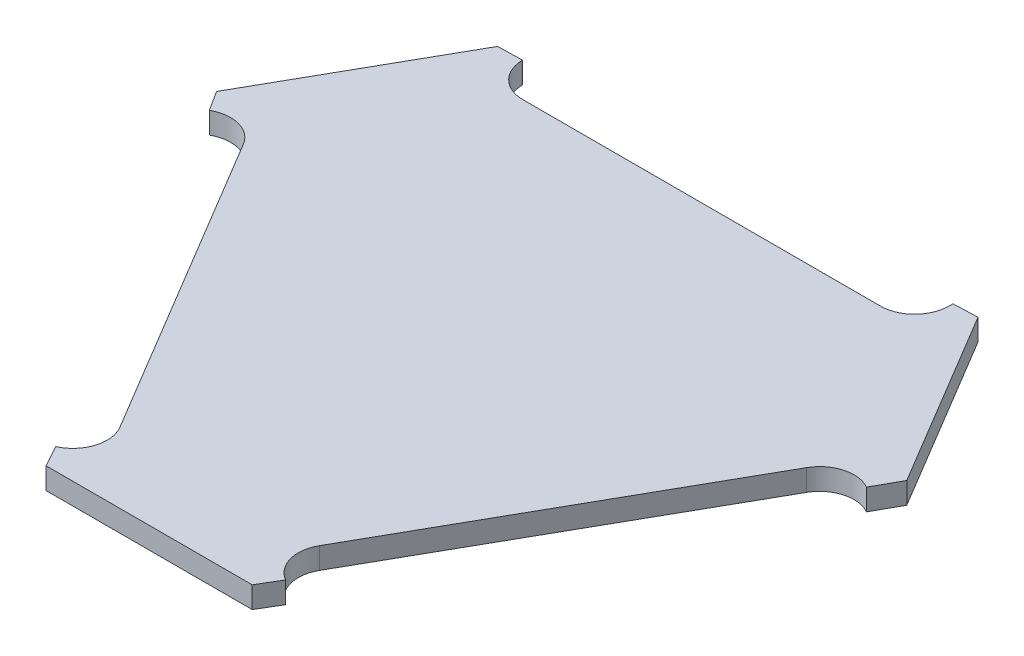
ISO-10303-21;
HEADER;
FILE_DESCRIPTION(('STEP AP214'),'2;1');
FILE_NAME('part.step','',(''),(''),'','','');
FILE_SCHEMA(('AUTOMOTIVE_DESIGN { 1 0 10303 214 1 1 1 1 }'));
ENDSEC;
DATA;
#1=APPLICATION_CONTEXT('core data for automotive mechanical design processes');
#2=APPLICATION_PROTOCOL_DEFINITION('international standard','automotive_design',2000,#1);
#3=PRODUCT_CONTEXT('',#1,'mechanical');
#4=PRODUCT('Part','Part','',(#3));
#5=PRODUCT_RELATED_PRODUCT_CATEGORY('part','',(#4));
#6=PRODUCT_DEFINITION_FORMATION('','',#4);
#7=PRODUCT_DEFINITION_CONTEXT('part definition',#1,'design');
#8=PRODUCT_DEFINITION('design','',#6,#7);
#9=PRODUCT_DEFINITION_SHAPE('','',#8);
#10=(LENGTH_UNIT() NAMED_UNIT(*) SI_UNIT(.MILLI.,.METRE.));
#11=(NAMED_UNIT(*) PLANE_ANGLE_UNIT() SI_UNIT($,.RADIAN.));
#12=(NAMED_UNIT(*) SI_UNIT($,.STERADIAN.) SOLID_ANGLE_UNIT());
#13=UNCERTAINTY_MEASURE_WITH_UNIT(LENGTH_MEASURE(1.E-05),#10,'distance_accuracy_value','');
#14=(GEOMETRIC_REPRESENTATION_CONTEXT(3) GLOBAL_UNCERTAINTY_ASSIGNED_CONTEXT((#13)) GLOBAL_UNIT_ASSIGNED_CONTEXT((#10,
#11,#12)) REPRESENTATION_CONTEXT('',''));
#15=CARTESIAN_POINT('',(0.,0.,0.));
#16=DIRECTION('',(0.,0.,1.));
#17=DIRECTION('',(1.,0.,0.));
#18=AXIS2_PLACEMENT_3D('',#15,#16,#17);
#19=CARTESIAN_POINT('',(112.426746773044,10.,-8.05853098429506));
#20=DIRECTION('',(0.876502133307898,0.,-0.481397974971545));
#21=DIRECTION('',(-0.481397974971545,0.,-0.876502133307898));
#22=AXIS2_PLACEMENT_3D('',#19,#20,#21);
#23=PLANE('',#22);
#24=DIRECTION('',(0.481397974971545,0.,0.876502133307898));
#25=VECTOR('',#24,1.);
#26=CARTESIAN_POINT('',(112.426746773044,0.,-8.05853098429506));
#27=LINE('',#26,#25);
#28=CARTESIAN_POINT('',(106.953563168046,0.,-18.0237933143885));
#29=VERTEX_POINT('',#28);
#30=CARTESIAN_POINT('',(112.426746773044,0.,-8.05853098429506));
#31=VERTEX_POINT('',#30);
#32=EDGE_CURVE('E201',#29,#31,#27,.T.);
#33=ORIENTED_EDGE('',*,*,#32,.T.);
#34=DIRECTION('',(0.,-1.,0.));
#35=VECTOR('',#34,1.);
#36=CARTESIAN_POINT('',(112.426746773044,10.,-8.05853098429506));
#37=LINE('',#36,#35);
#38=CARTESIAN_POINT('',(112.426746773044,10.,-8.05853098429506));
#39=VERTEX_POINT('',#38);
#40=EDGE_CURVE('E11',#39,#31,#37,.T.);
#41=ORIENTED_EDGE('',*,*,#40,.F.);
#42=DIRECTION('',(0.481397974971545,0.,0.876502133307898));
#43=VECTOR('',#42,1.);
#44=CARTESIAN_POINT('',(112.426746773044,10.,-8.05853098429506));
#45=LINE('',#44,#43);
#46=CARTESIAN_POINT('',(106.953563168046,10.,-18.0237933143885));
#47=VERTEX_POINT('',#46);
#48=EDGE_CURVE('E239',#47,#39,#45,.T.);
#49=ORIENTED_EDGE('',*,*,#48,.F.);
#50=DIRECTION('',(0.,-1.,0.));
#51=VECTOR('',#50,1.);
#52=CARTESIAN_POINT('',(106.953563168046,10.,-18.0237933143885));
#53=LINE('',#52,#51);
#54=EDGE_CURVE('E197',#47,#29,#53,.T.);
#55=ORIENTED_EDGE('',*,*,#54,.T.);
#56=EDGE_LOOP('',(#33,#41,#49,#55));
#57=FACE_BOUND('',#56,.T.);
#58=ADVANCED_FACE('F33',(#57),#23,.F.);
#59=CARTESIAN_POINT('',(112.426746773044,10.,-8.05853098429506));
#60=DIRECTION('',(0.,0.,-1.));
#61=DIRECTION('',(-1.,0.,0.));
#62=AXIS2_PLACEMENT_3D('',#59,#60,#61);
#63=PLANE('',#62);
#64=DIRECTION('',(1.,0.,0.));
#65=VECTOR('',#64,1.);
#66=CARTESIAN_POINT('',(112.426746773044,0.,-8.05853098429506));
#67=LINE('',#66,#65);
#68=CARTESIAN_POINT('',(208.426746773044,0.,-8.05853098429506));
#69=VERTEX_POINT('',#68);
#70=EDGE_CURVE('E204',#31,#69,#67,.T.);
#71=ORIENTED_EDGE('',*,*,#70,.T.);
#72=DIRECTION('',(0.,-1.,0.));
#73=VECTOR('',#72,1.);
#74=CARTESIAN_POINT('',(208.426746773044,10.,-8.05853098429506));
#75=LINE('',#74,#73);
#76=CARTESIAN_POINT('',(208.426746773044,10.,-8.05853098429506));
#77=VERTEX_POINT('',#76);
#78=EDGE_CURVE('E41',#77,#69,#75,.T.);
#79=ORIENTED_EDGE('',*,*,#78,.F.);
#80=DIRECTION('',(1.,0.,0.));
#81=VECTOR('',#80,1.);
#82=CARTESIAN_POINT('',(112.426746773044,10.,-8.05853098429506));
#83=LINE('',#82,#81);
#84=EDGE_CURVE('E128',#39,#77,#83,.T.);
#85=ORIENTED_EDGE('',*,*,#84,.F.);
#86=ORIENTED_EDGE('',*,*,#40,.T.);
#87=EDGE_LOOP('',(#71,#79,#85,#86));
#88=FACE_BOUND('',#87,.T.);
#89=ADVANCED_FACE('F357',(#88),#63,.F.);
#90=CARTESIAN_POINT('',(208.426746773044,10.,-8.05853098429506));
#91=DIRECTION('',(-0.857916883523361,0.,-0.513788498280726));
#92=DIRECTION('',(-0.513788498280726,0.,0.857916883523361));
#93=AXIS2_PLACEMENT_3D('',#90,#91,#92);
#94=PLANE('',#93);
#95=DIRECTION('',(0.513788498280726,0.,-0.857916883523361));
#96=VECTOR('',#95,1.);
#97=CARTESIAN_POINT('',(208.426746773044,0.,-8.05853098429506));
#98=LINE('',#97,#96);
#99=CARTESIAN_POINT('',(214.26818967773,0.,-17.8124910453658));
#100=VERTEX_POINT('',#99);
#101=EDGE_CURVE('E206',#69,#100,#98,.T.);
#102=ORIENTED_EDGE('',*,*,#101,.T.);
#103=DIRECTION('',(0.,-1.,0.));
#104=VECTOR('',#103,1.);
#105=CARTESIAN_POINT('',(214.26818967773,10.,-17.8124910453658));
#106=LINE('',#105,#104);
#107=CARTESIAN_POINT('',(214.26818967773,10.,-17.8124910453658));
#108=VERTEX_POINT('',#107);
#109=EDGE_CURVE('E282',#108,#100,#106,.T.);
#110=ORIENTED_EDGE('',*,*,#109,.F.);
#111=DIRECTION('',(0.513788498280726,0.,-0.857916883523361));
#112=VECTOR('',#111,1.);
#113=CARTESIAN_POINT('',(208.426746773044,10.,-8.05853098429506));
#114=LINE('',#113,#112);
#115=EDGE_CURVE('E290',#77,#108,#114,.T.);
#116=ORIENTED_EDGE('',*,*,#115,.F.);
#117=ORIENTED_EDGE('',*,*,#78,.T.);
#118=EDGE_LOOP('',(#102,#110,#116,#117));
#119=FACE_BOUND('',#118,.T.);
#120=ADVANCED_FACE('F288',(#119),#94,.F.);
#121=CARTESIAN_POINT('',(222.267694728695,10.,-31.6691832530893));
#122=DIRECTION('',(0.,-1.,0.));
#123=DIRECTION('',(0.,0.,-1.));
#124=AXIS2_PLACEMENT_3D('',#121,#122,#123);
#125=CYLINDRICAL_SURFACE('',#124,16.);
#126=CARTESIAN_POINT('',(222.267694728695,0.,-31.6691832530893));
#127=DIRECTION('',(0.,-1.,0.));
#128=DIRECTION('',(0.,0.,1.));
#129=AXIS2_PLACEMENT_3D('',#126,#127,#128);
#130=CIRCLE('',#129,16.);
#131=CARTESIAN_POINT('',(208.340233588799,0.,-39.5448309214831));
#132=VERTEX_POINT('',#131);
#133=EDGE_CURVE('E208',#100,#132,#130,.T.);
#134=ORIENTED_EDGE('',*,*,#133,.T.);
#135=DIRECTION('',(0.,-1.,0.));
#136=VECTOR('',#135,1.);
#137=CARTESIAN_POINT('',(208.340233588799,10.,-39.5448309214831));
#138=LINE('',#137,#136);
#139=CARTESIAN_POINT('',(208.340233588799,10.,-39.5448309214831));
#140=VERTEX_POINT('',#139);
#141=EDGE_CURVE('E279',#140,#132,#138,.T.);
#142=ORIENTED_EDGE('',*,*,#141,.F.);
#143=CARTESIAN_POINT('',(222.267694728695,10.,-31.6691832530893));
#144=DIRECTION('',(0.,-1.,0.));
#145=DIRECTION('',(0.,0.,1.));
#146=AXIS2_PLACEMENT_3D('',#143,#144,#145);
#147=CIRCLE('',#146,16.);
#148=EDGE_CURVE('E308',#108,#140,#147,.T.);
#149=ORIENTED_EDGE('',*,*,#148,.F.);
#150=ORIENTED_EDGE('',*,*,#109,.T.);
#151=EDGE_LOOP('',(#134,#142,#149,#150));
#152=FACE_BOUND('',#151,.T.);
#153=ADVANCED_FACE('F299',(#152),#125,.F.);
#154=CARTESIAN_POINT('',(208.340233588799,10.,-39.544830921483));
#155=DIRECTION('',(-0.870466321243524,0.,-0.49222797927461));
#156=DIRECTION('',(-0.49222797927461,0.,0.870466321243524));
#157=AXIS2_PLACEMENT_3D('',#154,#155,#156);
#158=PLANE('',#157);
#159=DIRECTION('',(0.49222797927461,0.,-0.870466321243524));
#160=VECTOR('',#159,1.);
#161=CARTESIAN_POINT('',(208.340233588799,0.,-39.544830921483));
#162=LINE('',#161,#160);
#163=CARTESIAN_POINT('',(290.262052012992,0.,-184.417099292688));
#164=VERTEX_POINT('',#163);
#165=EDGE_CURVE('E210',#132,#164,#162,.T.);
#166=ORIENTED_EDGE('',*,*,#165,.T.);
#167=DIRECTION('',(0.,-1.,0.));
#168=VECTOR('',#167,1.);
#169=CARTESIAN_POINT('',(290.262052012992,10.,-184.417099292688));
#170=LINE('',#169,#168);
#171=CARTESIAN_POINT('',(290.262052012992,10.,-184.417099292688));
#172=VERTEX_POINT('',#171);
#173=EDGE_CURVE('E276',#172,#164,#170,.T.);
#174=ORIENTED_EDGE('',*,*,#173,.F.);
#175=DIRECTION('',(0.49222797927461,0.,-0.870466321243524));
#176=VECTOR('',#175,1.);
#177=CARTESIAN_POINT('',(208.340233588799,10.,-39.544830921483));
#178=LINE('',#177,#176);
#179=EDGE_CURVE('E305',#140,#172,#178,.T.);
#180=ORIENTED_EDGE('',*,*,#179,.F.);
#181=ORIENTED_EDGE('',*,*,#141,.T.);
#182=EDGE_LOOP('',(#166,#174,#180,#181));
#183=FACE_BOUND('',#182,.T.);
#184=ADVANCED_FACE('F303',(#183),#158,.F.);
#185=CARTESIAN_POINT('',(304.189513152888,10.,-176.541451624294));
#186=DIRECTION('',(0.,-1.,0.));
#187=DIRECTION('',(0.,0.,-1.));
#188=AXIS2_PLACEMENT_3D('',#185,#186,#187);
#189=CYLINDRICAL_SURFACE('',#188,16.0000000000009);
#190=CARTESIAN_POINT('',(304.189513152888,0.,-176.541451624294));
#191=DIRECTION('',(0.,-1.,0.));
#192=DIRECTION('',(0.,0.,-1.));
#193=AXIS2_PLACEMENT_3D('',#190,#191,#192);
#194=CIRCLE('',#193,16.0000000000009);
#195=CARTESIAN_POINT('',(312.065160821272,0.,-190.468912764197));
#196=VERTEX_POINT('',#195);
#197=EDGE_CURVE('E212',#164,#196,#194,.T.);
#198=ORIENTED_EDGE('',*,*,#197,.T.);
#199=DIRECTION('',(0.,-1.,0.));
#200=VECTOR('',#199,1.);
#201=CARTESIAN_POINT('',(312.065160821272,10.,-190.468912764197));
#202=LINE('',#201,#200);
#203=CARTESIAN_POINT('',(312.065160821272,10.,-190.468912764197));
#204=VERTEX_POINT('',#203);
#205=EDGE_CURVE('E273',#204,#196,#202,.T.);
#206=ORIENTED_EDGE('',*,*,#205,.F.);
#207=CARTESIAN_POINT('',(304.189513152888,10.,-176.541451624294));
#208=DIRECTION('',(0.,-1.,0.));
#209=DIRECTION('',(0.,0.,-1.));
#210=AXIS2_PLACEMENT_3D('',#207,#208,#209);
#211=CIRCLE('',#210,16.0000000000009);
#212=EDGE_CURVE('E307',#172,#204,#211,.T.);
#213=ORIENTED_EDGE('',*,*,#212,.F.);
#214=ORIENTED_EDGE('',*,*,#173,.T.);
#215=EDGE_LOOP('',(#198,#206,#213,#214));
#216=FACE_BOUND('',#215,.T.);
#217=ADVANCED_FACE('F370',(#216),#189,.F.);
#218=CARTESIAN_POINT('',(318.76181291011,10.,-202.523064380965));
#219=DIRECTION('',(-0.87416031810434,0.,-0.485637455569192));
#220=DIRECTION('',(-0.485637455569192,0.,0.87416031810434));
#221=AXIS2_PLACEMENT_3D('',#218,#219,#220);
#222=PLANE('',#221);
#223=DIRECTION('',(0.485637455569192,0.,-0.87416031810434));
#224=VECTOR('',#223,1.);
#225=CARTESIAN_POINT('',(318.76181291011,0.,-202.523064380965));
#226=LINE('',#225,#224);
#227=CARTESIAN_POINT('',(318.76181291011,0.,-202.523064380965));
#228=VERTEX_POINT('',#227);
#229=EDGE_CURVE('E214',#196,#228,#226,.T.);
#230=ORIENTED_EDGE('',*,*,#229,.T.);
#231=DIRECTION('',(0.,-1.,0.));
#232=VECTOR('',#231,1.);
#233=CARTESIAN_POINT('',(318.76181291011,10.,-202.523064380965));
#234=LINE('',#233,#232);
#235=CARTESIAN_POINT('',(318.76181291011,10.,-202.523064380965));
#236=VERTEX_POINT('',#235);
#237=EDGE_CURVE('E270',#236,#228,#234,.T.);
#238=ORIENTED_EDGE('',*,*,#237,.F.);
#239=DIRECTION('',(0.485637455569192,0.,-0.87416031810434));
#240=VECTOR('',#239,1.);
#241=CARTESIAN_POINT('',(318.76181291011,10.,-202.523064380965));
#242=LINE('',#241,#240);
#243=EDGE_CURVE('E310',#204,#236,#242,.T.);
#244=ORIENTED_EDGE('',*,*,#243,.F.);
#245=ORIENTED_EDGE('',*,*,#205,.T.);
#246=EDGE_LOOP('',(#230,#238,#244,#245));
#247=FACE_BOUND('',#246,.T.);
#248=ADVANCED_FACE('F373',(#247),#222,.F.);
#249=CARTESIAN_POINT('',(269.518395909712,10.,-284.931109389477));
#250=DIRECTION('',(-0.858417135505332,0.,0.512952260420813));
#251=DIRECTION('',(0.512952260420813,0.,0.858417135505332));
#252=AXIS2_PLACEMENT_3D('',#249,#250,#251);
#253=PLANE('',#252);
#254=DIRECTION('',(-0.512952260420813,0.,-0.858417135505331));
#255=VECTOR('',#254,1.);
#256=CARTESIAN_POINT('',(269.518395909712,0.,-284.931109389477));
#257=LINE('',#256,#255);
#258=CARTESIAN_POINT('',(269.518395909712,0.,-284.931109389477));
#259=VERTEX_POINT('',#258);
#260=EDGE_CURVE('E216',#228,#259,#257,.T.);
#261=ORIENTED_EDGE('',*,*,#260,.T.);
#262=DIRECTION('',(0.,-1.,0.));
#263=VECTOR('',#262,1.);
#264=CARTESIAN_POINT('',(269.518395909712,10.,-284.931109389477));
#265=LINE('',#264,#263);
#266=CARTESIAN_POINT('',(269.518395909712,10.,-284.931109389477));
#267=VERTEX_POINT('',#266);
#268=EDGE_CURVE('E267',#267,#259,#265,.T.);
#269=ORIENTED_EDGE('',*,*,#268,.F.);
#270=DIRECTION('',(-0.512952260420813,0.,-0.858417135505331));
#271=VECTOR('',#270,1.);
#272=CARTESIAN_POINT('',(269.518395909712,10.,-284.931109389477));
#273=LINE('',#272,#271);
#274=EDGE_CURVE('E316',#236,#267,#273,.T.);
#275=ORIENTED_EDGE('',*,*,#274,.F.);
#276=ORIENTED_EDGE('',*,*,#237,.T.);
#277=EDGE_LOOP('',(#261,#269,#275,#276));
#278=FACE_BOUND('',#277,.T.);
#279=ADVANCED_FACE('F377',(#278),#253,.F.);
#280=CARTESIAN_POINT('',(269.518395909712,10.,-284.931109389477));
#281=DIRECTION('',(0.036694794134354,0.,0.999326519253561));
#282=DIRECTION('',(0.999326519253561,0.,-0.036694794134354));
#283=AXIS2_PLACEMENT_3D('',#280,#281,#282);
#284=PLANE('',#283);
#285=DIRECTION('',(-0.999326519253561,0.,0.036694794134354));
#286=VECTOR('',#285,1.);
#287=CARTESIAN_POINT('',(269.518395909712,0.,-284.931109389477));
#288=LINE('',#287,#286);
#289=CARTESIAN_POINT('',(258.259283582778,0.,-284.517680143868));
#290=VERTEX_POINT('',#289);
#291=EDGE_CURVE('E218',#259,#290,#288,.T.);
#292=ORIENTED_EDGE('',*,*,#291,.T.);
#293=DIRECTION('',(0.,-1.,0.));
#294=VECTOR('',#293,1.);
#295=CARTESIAN_POINT('',(258.259283582778,10.,-284.517680143868));
#296=LINE('',#295,#294);
#297=CARTESIAN_POINT('',(258.259283582778,10.,-284.517680143868));
#298=VERTEX_POINT('',#297);
#299=EDGE_CURVE('E264',#298,#290,#296,.T.);
#300=ORIENTED_EDGE('',*,*,#299,.F.);
#301=DIRECTION('',(-0.999326519253561,0.,0.036694794134354));
#302=VECTOR('',#301,1.);
#303=CARTESIAN_POINT('',(269.518395909712,10.,-284.931109389477));
#304=LINE('',#303,#302);
#305=EDGE_CURVE('E318',#267,#298,#304,.T.);
#306=ORIENTED_EDGE('',*,*,#305,.F.);
#307=ORIENTED_EDGE('',*,*,#268,.T.);
#308=EDGE_LOOP('',(#292,#300,#306,#307));
#309=FACE_BOUND('',#308,.T.);
#310=ADVANCED_FACE('F381',(#309),#284,.F.);
#311=CARTESIAN_POINT('',(258.259283582778,10.,-282.707559458768));
#312=DIRECTION('',(1.,0.,0.));
#313=DIRECTION('',(0.,0.,-1.));
#314=AXIS2_PLACEMENT_3D('',#311,#312,#313);
#315=PLANE('',#314);
#316=DIRECTION('',(0.,0.,1.));
#317=VECTOR('',#316,1.);
#318=CARTESIAN_POINT('',(258.259283582778,0.,-282.707559458768));
#319=LINE('',#318,#317);
#320=CARTESIAN_POINT('',(258.259283582778,0.,-282.707559458768));
#321=VERTEX_POINT('',#320);
#322=EDGE_CURVE('E220',#290,#321,#319,.T.);
#323=ORIENTED_EDGE('',*,*,#322,.T.);
#324=DIRECTION('',(0.,-1.,0.));
#325=VECTOR('',#324,1.);
#326=CARTESIAN_POINT('',(258.259283582778,10.,-282.707559458768));
#327=LINE('',#326,#325);
#328=CARTESIAN_POINT('',(258.259283582778,10.,-282.707559458768));
#329=VERTEX_POINT('',#328);
#330=EDGE_CURVE('E261',#329,#321,#327,.T.);
#331=ORIENTED_EDGE('',*,*,#330,.F.);
#332=DIRECTION('',(0.,0.,1.));
#333=VECTOR('',#332,1.);
#334=CARTESIAN_POINT('',(258.259283582778,10.,-282.707559458768));
#335=LINE('',#334,#333);
#336=EDGE_CURVE('E320',#298,#329,#335,.T.);
#337=ORIENTED_EDGE('',*,*,#336,.F.);
#338=ORIENTED_EDGE('',*,*,#299,.T.);
#339=EDGE_LOOP('',(#323,#331,#337,#338));
#340=FACE_BOUND('',#339,.T.);
#341=ADVANCED_FACE('F385',(#340),#315,.F.);
#342=CARTESIAN_POINT('',(242.259283582778,10.,-282.707559458768));
#343=DIRECTION('',(0.,-1.,0.));
#344=DIRECTION('',(0.,0.,-1.));
#345=AXIS2_PLACEMENT_3D('',#342,#343,#344);
#346=CYLINDRICAL_SURFACE('',#345,16.);
#347=CARTESIAN_POINT('',(242.259283582778,0.,-282.707559458768));
#348=DIRECTION('',(0.,-1.,0.));
#349=DIRECTION('',(0.,0.,1.));
#350=AXIS2_PLACEMENT_3D('',#347,#348,#349);
#351=CIRCLE('',#350,16.);
#352=CARTESIAN_POINT('',(242.259283582778,0.,-266.707559458768));
#353=VERTEX_POINT('',#352);
#354=EDGE_CURVE('E222',#321,#353,#351,.T.);
#355=ORIENTED_EDGE('',*,*,#354,.T.);
#356=DIRECTION('',(0.,-1.,0.));
#357=VECTOR('',#356,1.);
#358=CARTESIAN_POINT('',(242.259283582778,10.,-266.707559458768));
#359=LINE('',#358,#357);
#360=CARTESIAN_POINT('',(242.259283582778,10.,-266.707559458768));
#361=VERTEX_POINT('',#360);
#362=EDGE_CURVE('E258',#361,#353,#359,.T.);
#363=ORIENTED_EDGE('',*,*,#362,.F.);
#364=CARTESIAN_POINT('',(242.259283582778,10.,-282.707559458768));
#365=DIRECTION('',(0.,-1.,0.));
#366=DIRECTION('',(0.,0.,1.));
#367=AXIS2_PLACEMENT_3D('',#364,#365,#366);
#368=CIRCLE('',#367,16.);
#369=EDGE_CURVE('E322',#329,#361,#368,.T.);
#370=ORIENTED_EDGE('',*,*,#369,.F.);
#371=ORIENTED_EDGE('',*,*,#330,.T.);
#372=EDGE_LOOP('',(#355,#363,#370,#371));
#373=FACE_BOUND('',#372,.T.);
#374=ADVANCED_FACE('F389',(#373),#346,.F.);
#375=CARTESIAN_POINT('',(75.8286419420491,10.,-266.707559458768));
#376=DIRECTION('',(0.,0.,1.));
#377=DIRECTION('',(1.,0.,0.));
#378=AXIS2_PLACEMENT_3D('',#375,#376,#377);
#379=PLANE('',#378);
#380=DIRECTION('',(-1.,0.,0.));
#381=VECTOR('',#380,1.);
#382=CARTESIAN_POINT('',(75.8286419420491,0.,-266.707559458768));
#383=LINE('',#382,#381);
#384=CARTESIAN_POINT('',(75.8286419420491,0.,-266.707559458768));
#385=VERTEX_POINT('',#384);
#386=EDGE_CURVE('E224',#353,#385,#383,.T.);
#387=ORIENTED_EDGE('',*,*,#386,.T.);
#388=DIRECTION('',(0.,-1.,0.));
#389=VECTOR('',#388,1.);
#390=CARTESIAN_POINT('',(75.8286419420491,10.,-266.707559458768));
#391=LINE('',#390,#389);
#392=CARTESIAN_POINT('',(75.8286419420491,10.,-266.707559458768));
#393=VERTEX_POINT('',#392);
#394=EDGE_CURVE('E255',#393,#385,#391,.T.);
#395=ORIENTED_EDGE('',*,*,#394,.F.);
#396=DIRECTION('',(-1.,0.,0.));
#397=VECTOR('',#396,1.);
#398=CARTESIAN_POINT('',(75.8286419420491,10.,-266.707559458768));
#399=LINE('',#398,#397);
#400=EDGE_CURVE('E324',#361,#393,#399,.T.);
#401=ORIENTED_EDGE('',*,*,#400,.F.);
#402=ORIENTED_EDGE('',*,*,#362,.T.);
#403=EDGE_LOOP('',(#387,#395,#401,#402));
#404=FACE_BOUND('',#403,.T.);
#405=ADVANCED_FACE('F393',(#404),#379,.F.);
#406=CARTESIAN_POINT('',(75.8286419420491,10.,-282.707559458768));
#407=DIRECTION('',(0.,-1.,0.));
#408=DIRECTION('',(0.,0.,-1.));
#409=AXIS2_PLACEMENT_3D('',#406,#407,#408);
#410=CYLINDRICAL_SURFACE('',#409,16.0000000000007);
#411=CARTESIAN_POINT('',(75.8286419420491,0.,-282.707559458768));
#412=DIRECTION('',(0.,-1.,0.));
#413=DIRECTION('',(0.,0.,-1.));
#414=AXIS2_PLACEMENT_3D('',#411,#412,#413);
#415=CIRCLE('',#414,16.0000000000007);
#416=CARTESIAN_POINT('',(59.8336206969831,0.,-282.308441218258));
#417=VERTEX_POINT('',#416);
#418=EDGE_CURVE('E226',#385,#417,#415,.T.);
#419=ORIENTED_EDGE('',*,*,#418,.T.);
#420=DIRECTION('',(0.,-1.,0.));
#421=VECTOR('',#420,1.);
#422=CARTESIAN_POINT('',(59.8336206969831,10.,-282.308441218258));
#423=LINE('',#422,#421);
#424=CARTESIAN_POINT('',(59.8336206969831,10.,-282.308441218258));
#425=VERTEX_POINT('',#424);
#426=EDGE_CURVE('E252',#425,#417,#423,.T.);
#427=ORIENTED_EDGE('',*,*,#426,.F.);
#428=CARTESIAN_POINT('',(75.8286419420491,10.,-282.707559458768));
#429=DIRECTION('',(0.,-1.,0.));
#430=DIRECTION('',(0.,0.,-1.));
#431=AXIS2_PLACEMENT_3D('',#428,#429,#430);
#432=CIRCLE('',#431,16.0000000000007);
#433=EDGE_CURVE('E326',#393,#425,#432,.T.);
#434=ORIENTED_EDGE('',*,*,#433,.F.);
#435=ORIENTED_EDGE('',*,*,#394,.T.);
#436=EDGE_LOOP('',(#419,#427,#434,#435));
#437=FACE_BOUND('',#436,.T.);
#438=ADVANCED_FACE('F397',(#437),#410,.F.);
#439=CARTESIAN_POINT('',(59.8272223666791,10.,-282.564860040471));
#440=DIRECTION('',(-0.999688827816731,0.,0.0249448900260036));
#441=DIRECTION('',(0.0249448900260036,0.,0.999688827816732));
#442=AXIS2_PLACEMENT_3D('',#439,#440,#441);
#443=PLANE('',#442);
#444=DIRECTION('',(-0.0249448900260036,0.,-0.999688827816731));
#445=VECTOR('',#444,1.);
#446=CARTESIAN_POINT('',(59.8272223666791,0.,-282.564860040471));
#447=LINE('',#446,#445);
#448=CARTESIAN_POINT('',(59.8272223666791,0.,-282.564860040471));
#449=VERTEX_POINT('',#448);
#450=EDGE_CURVE('E228',#417,#449,#447,.T.);
#451=ORIENTED_EDGE('',*,*,#450,.T.);
#452=DIRECTION('',(0.,-1.,0.));
#453=VECTOR('',#452,1.);
#454=CARTESIAN_POINT('',(59.8272223666791,10.,-282.564860040471));
#455=LINE('',#454,#453);
#456=CARTESIAN_POINT('',(59.8272223666791,10.,-282.564860040471));
#457=VERTEX_POINT('',#456);
#458=EDGE_CURVE('E249',#457,#449,#455,.T.);
#459=ORIENTED_EDGE('',*,*,#458,.F.);
#460=DIRECTION('',(-0.0249448900260036,0.,-0.999688827816731));
#461=VECTOR('',#460,1.);
#462=CARTESIAN_POINT('',(59.8272223666791,10.,-282.564860040471));
#463=LINE('',#462,#461);
#464=EDGE_CURVE('E328',#425,#457,#463,.T.);
#465=ORIENTED_EDGE('',*,*,#464,.F.);
#466=ORIENTED_EDGE('',*,*,#426,.T.);
#467=EDGE_LOOP('',(#451,#459,#465,#466));
#468=FACE_BOUND('',#467,.T.);
#469=ADVANCED_FACE('F401',(#468),#443,.F.);
#470=CARTESIAN_POINT('',(48.4634624760157,10.,-282.281304064918));
#471=DIRECTION('',(0.0249448900318484,0.,0.999688827816586));
#472=DIRECTION('',(0.999688827816586,0.,-0.0249448900318484));
#473=AXIS2_PLACEMENT_3D('',#470,#471,#472);
#474=PLANE('',#473);
#475=DIRECTION('',(-0.999688827816586,0.,0.0249448900318484));
#476=VECTOR('',#475,1.);
#477=CARTESIAN_POINT('',(48.4634624760157,0.,-282.281304064918));
#478=LINE('',#477,#476);
#479=CARTESIAN_POINT('',(48.4634624760157,0.,-282.281304064918));
#480=VERTEX_POINT('',#479);
#481=EDGE_CURVE('E230',#449,#480,#478,.T.);
#482=ORIENTED_EDGE('',*,*,#481,.T.);
#483=DIRECTION('',(0.,-1.,0.));
#484=VECTOR('',#483,1.);
#485=CARTESIAN_POINT('',(48.4634624760157,10.,-282.281304064918));
#486=LINE('',#485,#484);
#487=CARTESIAN_POINT('',(48.4634624760157,10.,-282.281304064918));
#488=VERTEX_POINT('',#487);
#489=EDGE_CURVE('E246',#488,#480,#486,.T.);
#490=ORIENTED_EDGE('',*,*,#489,.F.);
#491=DIRECTION('',(-0.999688827816586,0.,0.0249448900318484));
#492=VECTOR('',#491,1.);
#493=CARTESIAN_POINT('',(48.4634624760157,10.,-282.281304064918));
#494=LINE('',#493,#492);
#495=EDGE_CURVE('E330',#457,#488,#494,.T.);
#496=ORIENTED_EDGE('',*,*,#495,.F.);
#497=ORIENTED_EDGE('',*,*,#458,.T.);
#498=EDGE_LOOP('',(#482,#490,#496,#497));
#499=FACE_BOUND('',#498,.T.);
#500=ADVANCED_FACE('F405',(#499),#474,.F.);
#501=CARTESIAN_POINT('',(1.2095764656531,10.,-198.71653722554));
#502=DIRECTION('',(0.870466321243524,0.,0.49222797927461));
#503=DIRECTION('',(0.49222797927461,0.,-0.870466321243524));
#504=AXIS2_PLACEMENT_3D('',#501,#502,#503);
#505=PLANE('',#504);
#506=DIRECTION('',(-0.49222797927461,0.,0.870466321243524));
#507=VECTOR('',#506,1.);
#508=CARTESIAN_POINT('',(1.2095764656531,0.,-198.71653722554));
#509=LINE('',#508,#507);
#510=CARTESIAN_POINT('',(1.2095764656531,0.,-198.71653722554));
#511=VERTEX_POINT('',#510);
#512=EDGE_CURVE('E232',#480,#511,#509,.T.);
#513=ORIENTED_EDGE('',*,*,#512,.T.);
#514=DIRECTION('',(0.,-1.,0.));
#515=VECTOR('',#514,1.);
#516=CARTESIAN_POINT('',(1.2095764656531,10.,-198.71653722554));
#517=LINE('',#516,#515);
#518=CARTESIAN_POINT('',(1.2095764656531,10.,-198.71653722554));
#519=VERTEX_POINT('',#518);
#520=EDGE_CURVE('E243',#519,#511,#517,.T.);
#521=ORIENTED_EDGE('',*,*,#520,.F.);
#522=DIRECTION('',(-0.49222797927461,0.,0.870466321243524));
#523=VECTOR('',#522,1.);
#524=CARTESIAN_POINT('',(1.2095764656531,10.,-198.71653722554));
#525=LINE('',#524,#523);
#526=EDGE_CURVE('E332',#488,#519,#525,.T.);
#527=ORIENTED_EDGE('',*,*,#526,.F.);
#528=ORIENTED_EDGE('',*,*,#489,.T.);
#529=EDGE_LOOP('',(#513,#521,#527,#528));
#530=FACE_BOUND('',#529,.T.);
#531=ADVANCED_FACE('F338',(#530),#505,.F.);
#532=CARTESIAN_POINT('',(1.2095764656531,10.,-198.71653722554));
#533=DIRECTION('',(0.844397135679678,0.,-0.535717721618349));
#534=DIRECTION('',(-0.535717721618349,0.,-0.844397135679678));
#535=AXIS2_PLACEMENT_3D('',#532,#533,#534);
#536=PLANE('',#535);
#537=DIRECTION('',(0.535717721618349,0.,0.844397135679678));
#538=VECTOR('',#537,1.);
#539=CARTESIAN_POINT('',(1.2095764656531,0.,-198.71653722554));
#540=LINE('',#539,#538);
#541=CARTESIAN_POINT('',(7.11981065077196,0.,-189.400838648247));
#542=VERTEX_POINT('',#541);
#543=EDGE_CURVE('E234',#511,#542,#540,.T.);
#544=ORIENTED_EDGE('',*,*,#543,.T.);
#545=DIRECTION('',(0.,-1.,0.));
#546=VECTOR('',#545,1.);
#547=CARTESIAN_POINT('',(7.11981065077196,10.,-189.400838648247));
#548=LINE('',#547,#546);
#549=CARTESIAN_POINT('',(7.11981065077196,10.,-189.400838648247));
#550=VERTEX_POINT('',#549);
#551=EDGE_CURVE('E192',#550,#542,#548,.T.);
#552=ORIENTED_EDGE('',*,*,#551,.F.);
#553=DIRECTION('',(0.535717721618349,0.,0.844397135679678));
#554=VECTOR('',#553,1.);
#555=CARTESIAN_POINT('',(1.2095764656531,10.,-198.71653722554));
#556=LINE('',#555,#554);
#557=EDGE_CURVE('E183',#519,#550,#556,.T.);
#558=ORIENTED_EDGE('',*,*,#557,.F.);
#559=ORIENTED_EDGE('',*,*,#520,.T.);
#560=EDGE_LOOP('',(#544,#552,#558,#559));
#561=FACE_BOUND('',#560,.T.);
#562=ADVANCED_FACE('F342',(#561),#536,.F.);
#563=CARTESIAN_POINT('',(14.9818830171541,10.,-175.465709725063));
#564=DIRECTION('',(0.,-1.,0.));
#565=DIRECTION('',(0.,0.,-1.));
#566=AXIS2_PLACEMENT_3D('',#563,#564,#565);
#567=CYLINDRICAL_SURFACE('',#566,15.9999999999999);
#568=CARTESIAN_POINT('',(14.9818830171541,0.,-175.465709725063));
#569=DIRECTION('',(0.,-1.,0.));
#570=DIRECTION('',(0.,0.,1.));
#571=AXIS2_PLACEMENT_3D('',#568,#569,#570);
#572=CIRCLE('',#571,15.9999999999999);
#573=CARTESIAN_POINT('',(28.7165571852393,0.,-183.672945891796));
#574=VERTEX_POINT('',#573);
#575=EDGE_CURVE('E191',#542,#574,#572,.T.);
#576=ORIENTED_EDGE('',*,*,#575,.T.);
#577=DIRECTION('',(0.,-1.,0.));
#578=VECTOR('',#577,1.);
#579=CARTESIAN_POINT('',(28.7165571852393,10.,-183.672945891796));
#580=LINE('',#579,#578);
#581=CARTESIAN_POINT('',(28.7165571852393,10.,-183.672945891796));
#582=VERTEX_POINT('',#581);
#583=EDGE_CURVE('E188',#582,#574,#580,.T.);
#584=ORIENTED_EDGE('',*,*,#583,.F.);
#585=CARTESIAN_POINT('',(14.9818830171541,10.,-175.465709725063));
#586=DIRECTION('',(0.,-1.,0.));
#587=DIRECTION('',(0.,0.,1.));
#588=AXIS2_PLACEMENT_3D('',#585,#586,#587);
#589=CIRCLE('',#588,15.9999999999999);
#590=EDGE_CURVE('E177',#550,#582,#589,.T.);
#591=ORIENTED_EDGE('',*,*,#590,.F.);
#592=ORIENTED_EDGE('',*,*,#551,.T.);
#593=EDGE_LOOP('',(#576,#584,#591,#592));
#594=FACE_BOUND('',#593,.T.);
#595=ADVANCED_FACE('F189',(#594),#567,.F.);
#596=CARTESIAN_POINT('',(28.7165571852392,10.,-183.672945891796));
#597=DIRECTION('',(0.858417135505331,0.,-0.512952260420813));
#598=DIRECTION('',(-0.512952260420813,0.,-0.858417135505331));
#599=AXIS2_PLACEMENT_3D('',#596,#597,#598);
#600=PLANE('',#599);
#601=DIRECTION('',(0.512952260420813,0.,0.858417135505331));
#602=VECTOR('',#601,1.);
#603=CARTESIAN_POINT('',(28.7165571852392,0.,-183.672945891796));
#604=LINE('',#603,#602);
#605=CARTESIAN_POINT('',(114.087531018138,0.,-40.8060312342468));
#606=VERTEX_POINT('',#605);
#607=EDGE_CURVE('E114',#574,#606,#604,.T.);
#608=ORIENTED_EDGE('',*,*,#607,.T.);
#609=DIRECTION('',(0.,-1.,0.));
#610=VECTOR('',#609,1.);
#611=CARTESIAN_POINT('',(114.087531018138,10.,-40.8060312342468));
#612=LINE('',#611,#610);
#613=CARTESIAN_POINT('',(114.087531018138,10.,-40.8060312342468));
#614=VERTEX_POINT('',#613);
#615=EDGE_CURVE('E193',#614,#606,#612,.T.);
#616=ORIENTED_EDGE('',*,*,#615,.F.);
#617=DIRECTION('',(0.512952260420813,0.,0.858417135505331));
#618=VECTOR('',#617,1.);
#619=CARTESIAN_POINT('',(28.7165571852392,10.,-183.672945891796));
#620=LINE('',#619,#618);
#621=EDGE_CURVE('E181',#582,#614,#620,.T.);
#622=ORIENTED_EDGE('',*,*,#621,.F.);
#623=ORIENTED_EDGE('',*,*,#583,.T.);
#624=EDGE_LOOP('',(#608,#616,#622,#623));
#625=FACE_BOUND('',#624,.T.);
#626=ADVANCED_FACE('F195',(#625),#600,.F.);
#627=CARTESIAN_POINT('',(100.352856850052,10.,-32.5987950675138));
#628=DIRECTION('',(0.,-1.,0.));
#629=DIRECTION('',(0.,0.,-1.));
#630=AXIS2_PLACEMENT_3D('',#627,#628,#629);
#631=CYLINDRICAL_SURFACE('',#630,16.);
#632=CARTESIAN_POINT('',(100.352856850052,0.,-32.5987950675138));
#633=DIRECTION('',(0.,-1.,0.));
#634=DIRECTION('',(0.,0.,-1.));
#635=AXIS2_PLACEMENT_3D('',#632,#633,#634);
#636=CIRCLE('',#635,16.);
#637=EDGE_CURVE('E120',#606,#29,#636,.T.);
#638=ORIENTED_EDGE('',*,*,#637,.T.);
#639=ORIENTED_EDGE('',*,*,#54,.F.);
#640=CARTESIAN_POINT('',(100.352856850052,10.,-32.5987950675138));
#641=DIRECTION('',(0.,-1.,0.));
#642=DIRECTION('',(0.,0.,-1.));
#643=AXIS2_PLACEMENT_3D('',#640,#641,#642);
#644=CIRCLE('',#643,16.);
#645=EDGE_CURVE('E49',#614,#47,#644,.T.);
#646=ORIENTED_EDGE('',*,*,#645,.F.);
#647=ORIENTED_EDGE('',*,*,#615,.T.);
#648=EDGE_LOOP('',(#638,#639,#646,#647));
#649=FACE_BOUND('',#648,.T.);
#650=ADVANCED_FACE('F346',(#649),#631,.F.);
#651=CARTESIAN_POINT('',(100.352856850052,10.,-32.5987950675138));
#652=DIRECTION('',(0.,-1.,0.));
#653=DIRECTION('',(0.,0.,-1.));
#654=AXIS2_PLACEMENT_3D('',#651,#652,#653);
#655=PLANE('',#654);
#656=ORIENTED_EDGE('',*,*,#48,.T.);
#657=ORIENTED_EDGE('',*,*,#84,.T.);
#658=ORIENTED_EDGE('',*,*,#115,.T.);
#659=ORIENTED_EDGE('',*,*,#148,.T.);
#660=ORIENTED_EDGE('',*,*,#179,.T.);
#661=ORIENTED_EDGE('',*,*,#212,.T.);
#662=ORIENTED_EDGE('',*,*,#243,.T.);
#663=ORIENTED_EDGE('',*,*,#274,.T.);
#664=ORIENTED_EDGE('',*,*,#305,.T.);
#665=ORIENTED_EDGE('',*,*,#336,.T.);
#666=ORIENTED_EDGE('',*,*,#369,.T.);
#667=ORIENTED_EDGE('',*,*,#400,.T.);
#668=ORIENTED_EDGE('',*,*,#433,.T.);
#669=ORIENTED_EDGE('',*,*,#464,.T.);
#670=ORIENTED_EDGE('',*,*,#495,.T.);
#671=ORIENTED_EDGE('',*,*,#526,.T.);
#672=ORIENTED_EDGE('',*,*,#557,.T.);
#673=ORIENTED_EDGE('',*,*,#590,.T.);
#674=ORIENTED_EDGE('',*,*,#621,.T.);
#675=ORIENTED_EDGE('',*,*,#645,.T.);
#676=EDGE_LOOP('',(#656,#657,#658,#659,#660,#661,#662,#663,#664,#665,#666,#667,#668,#669,#670,
#671,#672,#673,#674,#675));
#677=FACE_BOUND('',#676,.T.);
#678=ADVANCED_FACE('F179',(#677),#655,.F.);
#679=CARTESIAN_POINT('',(100.352856850052,0.,-32.5987950675138));
#680=DIRECTION('',(0.,-1.,0.));
#681=DIRECTION('',(0.,0.,-1.));
#682=AXIS2_PLACEMENT_3D('',#679,#680,#681);
#683=PLANE('',#682);
#684=ORIENTED_EDGE('',*,*,#32,.F.);
#685=ORIENTED_EDGE('',*,*,#637,.F.);
#686=ORIENTED_EDGE('',*,*,#607,.F.);
#687=ORIENTED_EDGE('',*,*,#575,.F.);
#688=ORIENTED_EDGE('',*,*,#543,.F.);
#689=ORIENTED_EDGE('',*,*,#512,.F.);
#690=ORIENTED_EDGE('',*,*,#481,.F.);
#691=ORIENTED_EDGE('',*,*,#450,.F.);
#692=ORIENTED_EDGE('',*,*,#418,.F.);
#693=ORIENTED_EDGE('',*,*,#386,.F.);
#694=ORIENTED_EDGE('',*,*,#354,.F.);
#695=ORIENTED_EDGE('',*,*,#322,.F.);
#696=ORIENTED_EDGE('',*,*,#291,.F.);
#697=ORIENTED_EDGE('',*,*,#260,.F.);
#698=ORIENTED_EDGE('',*,*,#229,.F.);
#699=ORIENTED_EDGE('',*,*,#197,.F.);
#700=ORIENTED_EDGE('',*,*,#165,.F.);
#701=ORIENTED_EDGE('',*,*,#133,.F.);
#702=ORIENTED_EDGE('',*,*,#101,.F.);
#703=ORIENTED_EDGE('',*,*,#70,.F.);
#704=EDGE_LOOP('',(#684,#685,#686,#687,#688,#689,#690,#691,#692,#693,#694,#695,#696,#697,#698,
#699,#700,#701,#702,#703));
#705=FACE_BOUND('',#704,.T.);
#706=ADVANCED_FACE('F294',(#705),#683,.T.);
#707=CLOSED_SHELL('',(#58,#89,#120,#153,#184,#217,#248,#279,#310,#341,#374,#405,#438,#469,#500,
#531,#562,#595,#626,#650,#678,#706));
#708=MANIFOLD_SOLID_BREP('B2',#707);
#709=ADVANCED_BREP_SHAPE_REPRESENTATION('',(#18,#708),#14);
#710=SHAPE_DEFINITION_REPRESENTATION(#9,#709);
ENDSEC;
END-ISO-10303-21;
